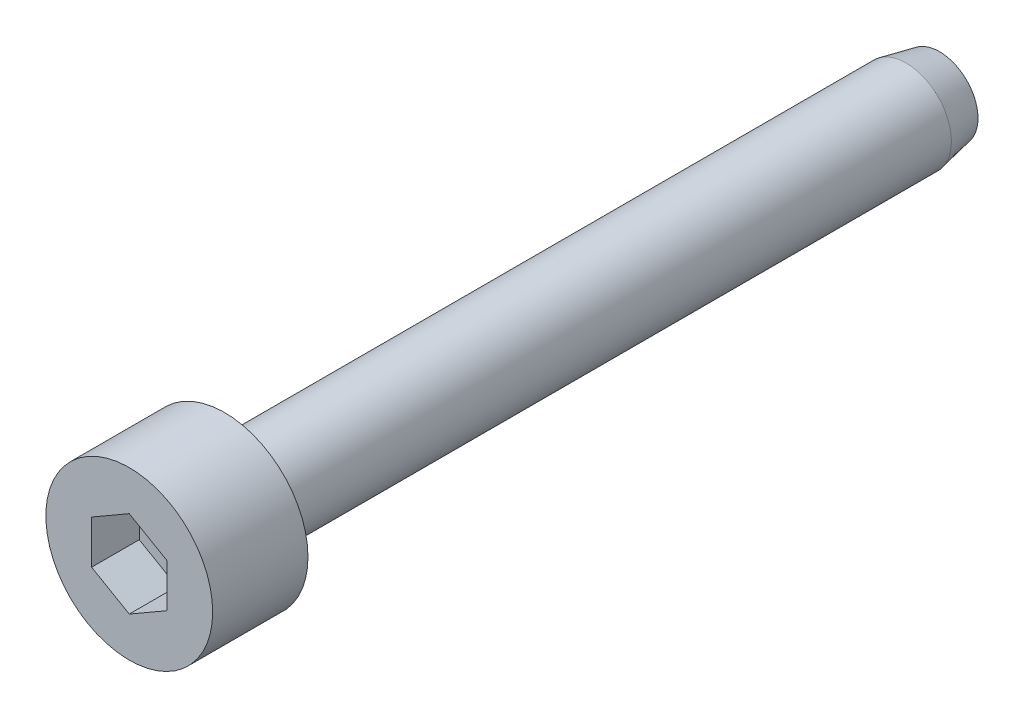
ISO-10303-21;
HEADER;
FILE_DESCRIPTION(('STEP AP214'),'2;1');
FILE_NAME('part.step','',(''),(''),'','','');
FILE_SCHEMA(('AUTOMOTIVE_DESIGN { 1 0 10303 214 1 1 1 1 }'));
ENDSEC;
DATA;
#1=APPLICATION_CONTEXT('core data for automotive mechanical design processes');
#2=APPLICATION_PROTOCOL_DEFINITION('international standard','automotive_design',2000,#1);
#3=PRODUCT_CONTEXT('',#1,'mechanical');
#4=PRODUCT('Part','Part','',(#3));
#5=PRODUCT_RELATED_PRODUCT_CATEGORY('part','',(#4));
#6=PRODUCT_DEFINITION_FORMATION('','',#4);
#7=PRODUCT_DEFINITION_CONTEXT('part definition',#1,'design');
#8=PRODUCT_DEFINITION('design','',#6,#7);
#9=PRODUCT_DEFINITION_SHAPE('','',#8);
#10=(LENGTH_UNIT() NAMED_UNIT(*) SI_UNIT(.MILLI.,.METRE.));
#11=(NAMED_UNIT(*) PLANE_ANGLE_UNIT() SI_UNIT($,.RADIAN.));
#12=(NAMED_UNIT(*) SI_UNIT($,.STERADIAN.) SOLID_ANGLE_UNIT());
#13=UNCERTAINTY_MEASURE_WITH_UNIT(LENGTH_MEASURE(1.E-05),#10,'distance_accuracy_value','');
#14=(GEOMETRIC_REPRESENTATION_CONTEXT(3) GLOBAL_UNCERTAINTY_ASSIGNED_CONTEXT((#13)) GLOBAL_UNIT_ASSIGNED_CONTEXT((#10,
#11,#12)) REPRESENTATION_CONTEXT('',''));
#15=CARTESIAN_POINT('',(0.,0.,0.));
#16=DIRECTION('',(0.,0.,1.));
#17=DIRECTION('',(1.,0.,0.));
#18=AXIS2_PLACEMENT_3D('',#15,#16,#17);
#19=CARTESIAN_POINT('',(0.,0.,-34.));
#20=DIRECTION('',(0.,0.,1.));
#21=DIRECTION('',(1.,0.,0.));
#22=AXIS2_PLACEMENT_3D('',#19,#20,#21);
#23=PLANE('',#22);
#24=CARTESIAN_POINT('',(0.,0.,-34.));
#25=DIRECTION('',(0.,0.,1.));
#26=DIRECTION('',(1.,0.,0.));
#27=AXIS2_PLACEMENT_3D('',#24,#25,#26);
#28=CIRCLE('',#27,1.615);
#29=CARTESIAN_POINT('',(1.615,0.,-34.));
#30=VERTEX_POINT('',#29);
#31=EDGE_CURVE('E11',#30,#30,#28,.T.);
#32=ORIENTED_EDGE('',*,*,#31,.F.);
#33=EDGE_LOOP('',(#32));
#34=FACE_BOUND('',#33,.T.);
#35=ADVANCED_FACE('F17',(#34),#23,.F.);
#36=CARTESIAN_POINT('',(0.,0.,-32.6));
#37=DIRECTION('',(0.,0.,1.));
#38=DIRECTION('',(1.,0.,0.));
#39=AXIS2_PLACEMENT_3D('',#36,#37,#38);
#40=CONICAL_SURFACE('',#39,1.9,0.20082725537);
#41=ORIENTED_EDGE('',*,*,#31,.T.);
#42=EDGE_LOOP('',(#41));
#43=FACE_BOUND('',#42,.T.);
#44=CARTESIAN_POINT('',(0.,0.,-32.6));
#45=DIRECTION('',(0.,0.,1.));
#46=DIRECTION('',(1.,0.,0.));
#47=AXIS2_PLACEMENT_3D('',#44,#45,#46);
#48=CIRCLE('',#47,1.9);
#49=CARTESIAN_POINT('',(1.9,0.,-32.6));
#50=VERTEX_POINT('',#49);
#51=EDGE_CURVE('E25',#50,#50,#48,.T.);
#52=ORIENTED_EDGE('',*,*,#51,.F.);
#53=EDGE_LOOP('',(#52));
#54=FACE_BOUND('',#53,.T.);
#55=ADVANCED_FACE('F198',(#43,#54),#40,.T.);
#56=CARTESIAN_POINT('',(0.,0.,-2.));
#57=DIRECTION('',(0.,0.,1.));
#58=DIRECTION('',(1.,0.,0.));
#59=AXIS2_PLACEMENT_3D('',#56,#57,#58);
#60=PLANE('',#59);
#61=DIRECTION('',(-0.866025403784329,0.50000000000019,0.));
#62=VECTOR('',#61,1.);
#63=CARTESIAN_POINT('',(1.58,0.91221342532,-2.));
#64=LINE('',#63,#62);
#65=CARTESIAN_POINT('',(1.58,0.91221342532,-2.));
#66=VERTEX_POINT('',#65);
#67=CARTESIAN_POINT('',(0.,1.824426850639,-2.));
#68=VERTEX_POINT('',#67);
#69=EDGE_CURVE('E92',#66,#68,#64,.T.);
#70=ORIENTED_EDGE('',*,*,#69,.T.);
#71=DIRECTION('',(-0.866025403784329,-0.50000000000019,0.));
#72=VECTOR('',#71,1.);
#73=CARTESIAN_POINT('',(0.,1.824426850639,-2.));
#74=LINE('',#73,#72);
#75=CARTESIAN_POINT('',(-1.58,0.91221342532,-2.));
#76=VERTEX_POINT('',#75);
#77=EDGE_CURVE('E128',#68,#76,#74,.T.);
#78=ORIENTED_EDGE('',*,*,#77,.T.);
#79=DIRECTION('',(0.,-1.,0.));
#80=VECTOR('',#79,1.);
#81=CARTESIAN_POINT('',(-1.58,0.91221342532,-2.));
#82=LINE('',#81,#80);
#83=CARTESIAN_POINT('',(-1.58,-0.91221342532,-2.));
#84=VERTEX_POINT('',#83);
#85=EDGE_CURVE('E156',#76,#84,#82,.T.);
#86=ORIENTED_EDGE('',*,*,#85,.T.);
#87=DIRECTION('',(0.866025403784329,-0.50000000000019,0.));
#88=VECTOR('',#87,1.);
#89=CARTESIAN_POINT('',(-1.58,-0.91221342532,-2.));
#90=LINE('',#89,#88);
#91=CARTESIAN_POINT('',(0.,-1.824426850639,-2.));
#92=VERTEX_POINT('',#91);
#93=EDGE_CURVE('E170',#84,#92,#90,.T.);
#94=ORIENTED_EDGE('',*,*,#93,.T.);
#95=DIRECTION('',(0.866025403784329,0.50000000000019,0.));
#96=VECTOR('',#95,1.);
#97=CARTESIAN_POINT('',(0.,-1.824426850639,-2.));
#98=LINE('',#97,#96);
#99=CARTESIAN_POINT('',(1.58,-0.91221342532,-2.));
#100=VERTEX_POINT('',#99);
#101=EDGE_CURVE('E46',#92,#100,#98,.T.);
#102=ORIENTED_EDGE('',*,*,#101,.T.);
#103=DIRECTION('',(0.,1.,0.));
#104=VECTOR('',#103,1.);
#105=CARTESIAN_POINT('',(1.58,-0.91221342532,-2.));
#106=LINE('',#105,#104);
#107=EDGE_CURVE('E40',#100,#66,#106,.T.);
#108=ORIENTED_EDGE('',*,*,#107,.T.);
#109=EDGE_LOOP('',(#70,#78,#86,#94,#102,#108));
#110=FACE_BOUND('',#109,.T.);
#111=ADVANCED_FACE('F173',(#110),#60,.T.);
#112=CARTESIAN_POINT('',(0.,0.,-34.));
#113=DIRECTION('',(0.,0.,1.));
#114=DIRECTION('',(1.,0.,0.));
#115=AXIS2_PLACEMENT_3D('',#112,#113,#114);
#116=CYLINDRICAL_SURFACE('',#115,1.9);
#117=CARTESIAN_POINT('',(0.,0.,-4.));
#118=DIRECTION('',(0.,0.,1.));
#119=DIRECTION('',(1.,0.,0.));
#120=AXIS2_PLACEMENT_3D('',#117,#118,#119);
#121=CIRCLE('',#120,1.9);
#122=CARTESIAN_POINT('',(1.9,0.,-4.));
#123=VERTEX_POINT('',#122);
#124=EDGE_CURVE('E139',#123,#123,#121,.T.);
#125=ORIENTED_EDGE('',*,*,#124,.F.);
#126=EDGE_LOOP('',(#125));
#127=FACE_BOUND('',#126,.T.);
#128=ORIENTED_EDGE('',*,*,#51,.T.);
#129=EDGE_LOOP('',(#128));
#130=FACE_BOUND('',#129,.T.);
#131=ADVANCED_FACE('F206',(#127,#130),#116,.T.);
#132=CARTESIAN_POINT('',(1.58,-0.91221342532,0.));
#133=DIRECTION('',(1.,0.,0.));
#134=DIRECTION('',(0.,1.,0.));
#135=AXIS2_PLACEMENT_3D('',#132,#133,#134);
#136=PLANE('',#135);
#137=DIRECTION('',(0.,1.,0.));
#138=VECTOR('',#137,1.);
#139=CARTESIAN_POINT('',(1.58,-0.91221342532,0.));
#140=LINE('',#139,#138);
#141=CARTESIAN_POINT('',(1.58,-0.91221342532,0.));
#142=VERTEX_POINT('',#141);
#143=CARTESIAN_POINT('',(1.58,0.91221342532,0.));
#144=VERTEX_POINT('',#143);
#145=EDGE_CURVE('E99',#142,#144,#140,.T.);
#146=ORIENTED_EDGE('',*,*,#145,.T.);
#147=DIRECTION('',(0.,0.,-1.));
#148=VECTOR('',#147,1.);
#149=CARTESIAN_POINT('',(1.58,0.91221342532,0.));
#150=LINE('',#149,#148);
#151=EDGE_CURVE('E86',#144,#66,#150,.T.);
#152=ORIENTED_EDGE('',*,*,#151,.T.);
#153=ORIENTED_EDGE('',*,*,#107,.F.);
#154=DIRECTION('',(0.,0.,-1.));
#155=VECTOR('',#154,1.);
#156=CARTESIAN_POINT('',(1.58,-0.91221342532,0.));
#157=LINE('',#156,#155);
#158=EDGE_CURVE('E105',#142,#100,#157,.T.);
#159=ORIENTED_EDGE('',*,*,#158,.F.);
#160=EDGE_LOOP('',(#146,#152,#153,#159));
#161=FACE_BOUND('',#160,.T.);
#162=ADVANCED_FACE('F101',(#161),#136,.F.);
#163=CARTESIAN_POINT('',(0.,-1.824426850639,0.));
#164=DIRECTION('',(0.50000000000019,-0.866025403784329,0.));
#165=DIRECTION('',(0.,0.,-1.));
#166=AXIS2_PLACEMENT_3D('',#163,#164,#165);
#167=PLANE('',#166);
#168=DIRECTION('',(0.866025403784329,0.50000000000019,0.));
#169=VECTOR('',#168,1.);
#170=CARTESIAN_POINT('',(0.,-1.824426850639,0.));
#171=LINE('',#170,#169);
#172=CARTESIAN_POINT('',(0.,-1.824426850639,0.));
#173=VERTEX_POINT('',#172);
#174=EDGE_CURVE('E110',#173,#142,#171,.T.);
#175=ORIENTED_EDGE('',*,*,#174,.T.);
#176=ORIENTED_EDGE('',*,*,#158,.T.);
#177=ORIENTED_EDGE('',*,*,#101,.F.);
#178=DIRECTION('',(0.,0.,-1.));
#179=VECTOR('',#178,1.);
#180=CARTESIAN_POINT('',(0.,-1.824426850639,0.));
#181=LINE('',#180,#179);
#182=EDGE_CURVE('E159',#173,#92,#181,.T.);
#183=ORIENTED_EDGE('',*,*,#182,.F.);
#184=EDGE_LOOP('',(#175,#176,#177,#183));
#185=FACE_BOUND('',#184,.T.);
#186=ADVANCED_FACE('F175',(#185),#167,.F.);
#187=CARTESIAN_POINT('',(-1.58,-0.91221342532,0.));
#188=DIRECTION('',(-0.50000000000019,-0.866025403784329,0.));
#189=DIRECTION('',(-0.866025403784329,0.50000000000019,0.));
#190=AXIS2_PLACEMENT_3D('',#187,#188,#189);
#191=PLANE('',#190);
#192=DIRECTION('',(0.866025403784329,-0.50000000000019,0.));
#193=VECTOR('',#192,1.);
#194=CARTESIAN_POINT('',(-1.58,-0.91221342532,0.));
#195=LINE('',#194,#193);
#196=CARTESIAN_POINT('',(-1.58,-0.91221342532,0.));
#197=VERTEX_POINT('',#196);
#198=EDGE_CURVE('E130',#197,#173,#195,.T.);
#199=ORIENTED_EDGE('',*,*,#198,.T.);
#200=ORIENTED_EDGE('',*,*,#182,.T.);
#201=ORIENTED_EDGE('',*,*,#93,.F.);
#202=DIRECTION('',(0.,0.,-1.));
#203=VECTOR('',#202,1.);
#204=CARTESIAN_POINT('',(-1.58,-0.91221342532,0.));
#205=LINE('',#204,#203);
#206=EDGE_CURVE('E135',#197,#84,#205,.T.);
#207=ORIENTED_EDGE('',*,*,#206,.F.);
#208=EDGE_LOOP('',(#199,#200,#201,#207));
#209=FACE_BOUND('',#208,.T.);
#210=ADVANCED_FACE('F178',(#209),#191,.F.);
#211=CARTESIAN_POINT('',(-1.58,0.91221342532,0.));
#212=DIRECTION('',(-1.,0.,0.));
#213=DIRECTION('',(0.,0.,1.));
#214=AXIS2_PLACEMENT_3D('',#211,#212,#213);
#215=PLANE('',#214);
#216=DIRECTION('',(0.,-1.,0.));
#217=VECTOR('',#216,1.);
#218=CARTESIAN_POINT('',(-1.58,0.91221342532,0.));
#219=LINE('',#218,#217);
#220=CARTESIAN_POINT('',(-1.58,0.91221342532,0.));
#221=VERTEX_POINT('',#220);
#222=EDGE_CURVE('E136',#221,#197,#219,.T.);
#223=ORIENTED_EDGE('',*,*,#222,.T.);
#224=ORIENTED_EDGE('',*,*,#206,.T.);
#225=ORIENTED_EDGE('',*,*,#85,.F.);
#226=DIRECTION('',(0.,0.,-1.));
#227=VECTOR('',#226,1.);
#228=CARTESIAN_POINT('',(-1.58,0.91221342532,0.));
#229=LINE('',#228,#227);
#230=EDGE_CURVE('E100',#221,#76,#229,.T.);
#231=ORIENTED_EDGE('',*,*,#230,.F.);
#232=EDGE_LOOP('',(#223,#224,#225,#231));
#233=FACE_BOUND('',#232,.T.);
#234=ADVANCED_FACE('F181',(#233),#215,.F.);
#235=CARTESIAN_POINT('',(0.,1.824426850639,0.));
#236=DIRECTION('',(-0.50000000000019,0.866025403784329,0.));
#237=DIRECTION('',(0.,0.,1.));
#238=AXIS2_PLACEMENT_3D('',#235,#236,#237);
#239=PLANE('',#238);
#240=DIRECTION('',(-0.866025403784329,-0.50000000000019,0.));
#241=VECTOR('',#240,1.);
#242=CARTESIAN_POINT('',(0.,1.824426850639,0.));
#243=LINE('',#242,#241);
#244=CARTESIAN_POINT('',(0.,1.824426850639,0.));
#245=VERTEX_POINT('',#244);
#246=EDGE_CURVE('E111',#245,#221,#243,.T.);
#247=ORIENTED_EDGE('',*,*,#246,.T.);
#248=ORIENTED_EDGE('',*,*,#230,.T.);
#249=ORIENTED_EDGE('',*,*,#77,.F.);
#250=DIRECTION('',(0.,0.,-1.));
#251=VECTOR('',#250,1.);
#252=CARTESIAN_POINT('',(0.,1.824426850639,0.));
#253=LINE('',#252,#251);
#254=EDGE_CURVE('E134',#245,#68,#253,.T.);
#255=ORIENTED_EDGE('',*,*,#254,.F.);
#256=EDGE_LOOP('',(#247,#248,#249,#255));
#257=FACE_BOUND('',#256,.T.);
#258=ADVANCED_FACE('F182',(#257),#239,.F.);
#259=CARTESIAN_POINT('',(1.58,0.91221342532,0.));
#260=DIRECTION('',(0.50000000000019,0.866025403784329,0.));
#261=DIRECTION('',(0.,0.,-1.));
#262=AXIS2_PLACEMENT_3D('',#259,#260,#261);
#263=PLANE('',#262);
#264=DIRECTION('',(-0.866025403784329,0.50000000000019,0.));
#265=VECTOR('',#264,1.);
#266=CARTESIAN_POINT('',(1.58,0.91221342532,0.));
#267=LINE('',#266,#265);
#268=EDGE_CURVE('E91',#144,#245,#267,.T.);
#269=ORIENTED_EDGE('',*,*,#268,.T.);
#270=ORIENTED_EDGE('',*,*,#254,.T.);
#271=ORIENTED_EDGE('',*,*,#69,.F.);
#272=ORIENTED_EDGE('',*,*,#151,.F.);
#273=EDGE_LOOP('',(#269,#270,#271,#272));
#274=FACE_BOUND('',#273,.T.);
#275=ADVANCED_FACE('F89',(#274),#263,.F.);
#276=CARTESIAN_POINT('',(0.,0.,-4.));
#277=DIRECTION('',(0.,0.,1.));
#278=DIRECTION('',(1.,0.,0.));
#279=AXIS2_PLACEMENT_3D('',#276,#277,#278);
#280=PLANE('',#279);
#281=ORIENTED_EDGE('',*,*,#124,.T.);
#282=EDGE_LOOP('',(#281));
#283=FACE_BOUND('',#282,.T.);
#284=CARTESIAN_POINT('',(0.,0.,-4.));
#285=DIRECTION('',(0.,0.,1.));
#286=DIRECTION('',(1.,0.,0.));
#287=AXIS2_PLACEMENT_3D('',#284,#285,#286);
#288=CIRCLE('',#287,3.5);
#289=CARTESIAN_POINT('',(3.5,0.,-4.));
#290=VERTEX_POINT('',#289);
#291=EDGE_CURVE('E116',#290,#290,#288,.T.);
#292=ORIENTED_EDGE('',*,*,#291,.F.);
#293=EDGE_LOOP('',(#292));
#294=FACE_BOUND('',#293,.T.);
#295=ADVANCED_FACE('F195',(#283,#294),#280,.F.);
#296=CARTESIAN_POINT('',(0.,0.,0.));
#297=DIRECTION('',(0.,0.,1.));
#298=DIRECTION('',(1.,0.,0.));
#299=AXIS2_PLACEMENT_3D('',#296,#297,#298);
#300=PLANE('',#299);
#301=ORIENTED_EDGE('',*,*,#268,.F.);
#302=ORIENTED_EDGE('',*,*,#145,.F.);
#303=ORIENTED_EDGE('',*,*,#174,.F.);
#304=ORIENTED_EDGE('',*,*,#198,.F.);
#305=ORIENTED_EDGE('',*,*,#222,.F.);
#306=ORIENTED_EDGE('',*,*,#246,.F.);
#307=EDGE_LOOP('',(#301,#302,#303,#304,#305,#306));
#308=FACE_BOUND('',#307,.T.);
#309=CARTESIAN_POINT('',(0.,0.,0.));
#310=DIRECTION('',(0.,0.,1.));
#311=DIRECTION('',(1.,0.,0.));
#312=AXIS2_PLACEMENT_3D('',#309,#310,#311);
#313=CIRCLE('',#312,3.5);
#314=CARTESIAN_POINT('',(3.5,0.,0.));
#315=VERTEX_POINT('',#314);
#316=EDGE_CURVE('E121',#315,#315,#313,.T.);
#317=ORIENTED_EDGE('',*,*,#316,.T.);
#318=EDGE_LOOP('',(#317));
#319=FACE_BOUND('',#318,.T.);
#320=ADVANCED_FACE('F109',(#308,#319),#300,.T.);
#321=CARTESIAN_POINT('',(0.,0.,-4.));
#322=DIRECTION('',(0.,0.,1.));
#323=DIRECTION('',(1.,0.,0.));
#324=AXIS2_PLACEMENT_3D('',#321,#322,#323);
#325=CYLINDRICAL_SURFACE('',#324,3.5);
#326=ORIENTED_EDGE('',*,*,#316,.F.);
#327=EDGE_LOOP('',(#326));
#328=FACE_BOUND('',#327,.T.);
#329=ORIENTED_EDGE('',*,*,#291,.T.);
#330=EDGE_LOOP('',(#329));
#331=FACE_BOUND('',#330,.T.);
#332=ADVANCED_FACE('F222',(#328,#331),#325,.T.);
#333=CLOSED_SHELL('',(#35,#55,#111,#131,#162,#186,#210,#234,#258,#275,#295,#320,#332));
#334=MANIFOLD_SOLID_BREP('B1',#333);
#335=ADVANCED_BREP_SHAPE_REPRESENTATION('',(#18,#334),#14);
#336=SHAPE_DEFINITION_REPRESENTATION(#9,#335);
ENDSEC;
END-ISO-10303-21;
